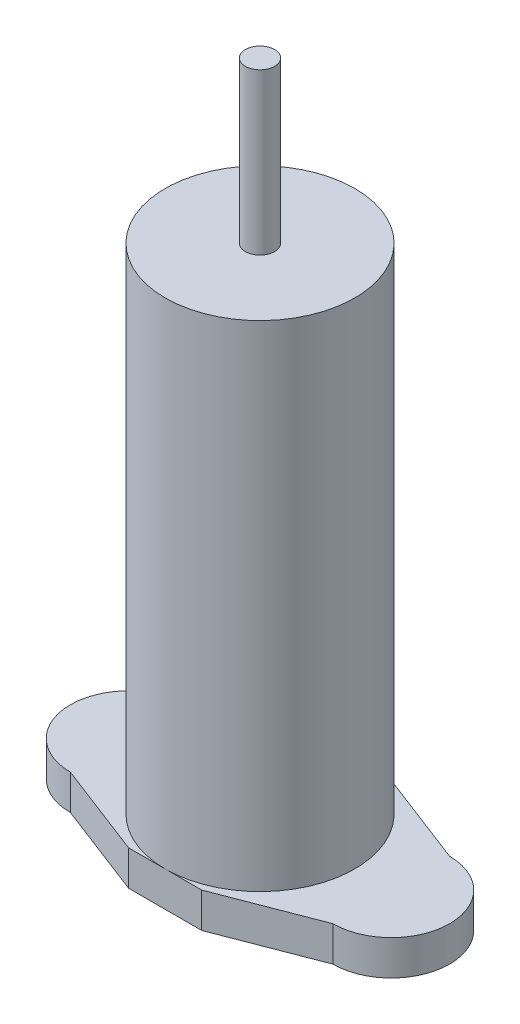
ISO-10303-21;
HEADER;
FILE_DESCRIPTION(('STEP AP214'),'2;1');
FILE_NAME('part.step','',(''),(''),'','','');
FILE_SCHEMA(('AUTOMOTIVE_DESIGN { 1 0 10303 214 1 1 1 1 }'));
ENDSEC;
DATA;
#1=APPLICATION_CONTEXT('core data for automotive mechanical design processes');
#2=APPLICATION_PROTOCOL_DEFINITION('international standard','automotive_design',2000,#1);
#3=PRODUCT_CONTEXT('',#1,'mechanical');
#4=PRODUCT('Part','Part','',(#3));
#5=PRODUCT_RELATED_PRODUCT_CATEGORY('part','',(#4));
#6=PRODUCT_DEFINITION_FORMATION('','',#4);
#7=PRODUCT_DEFINITION_CONTEXT('part definition',#1,'design');
#8=PRODUCT_DEFINITION('design','',#6,#7);
#9=PRODUCT_DEFINITION_SHAPE('','',#8);
#10=(LENGTH_UNIT() NAMED_UNIT(*) SI_UNIT(.MILLI.,.METRE.));
#11=(NAMED_UNIT(*) PLANE_ANGLE_UNIT() SI_UNIT($,.RADIAN.));
#12=(NAMED_UNIT(*) SI_UNIT($,.STERADIAN.) SOLID_ANGLE_UNIT());
#13=UNCERTAINTY_MEASURE_WITH_UNIT(LENGTH_MEASURE(1.E-05),#10,'distance_accuracy_value','');
#14=(GEOMETRIC_REPRESENTATION_CONTEXT(3) GLOBAL_UNCERTAINTY_ASSIGNED_CONTEXT((#13)) GLOBAL_UNIT_ASSIGNED_CONTEXT((#10,
#11,#12)) REPRESENTATION_CONTEXT('',''));
#15=CARTESIAN_POINT('',(0.,0.,0.));
#16=DIRECTION('',(0.,0.,1.));
#17=DIRECTION('',(1.,0.,0.));
#18=AXIS2_PLACEMENT_3D('',#15,#16,#17);
#19=CARTESIAN_POINT('',(0.,2.4,0.));
#20=DIRECTION('',(0.,1.,0.));
#21=DIRECTION('',(0.,0.,1.));
#22=AXIS2_PLACEMENT_3D('',#19,#20,#21);
#23=PLANE('',#22);
#24=DIRECTION('',(1.,0.,0.));
#25=VECTOR('',#24,1.);
#26=CARTESIAN_POINT('',(0.,2.4,6.5));
#27=LINE('',#26,#25);
#28=CARTESIAN_POINT('',(-2.50563715295568,2.4,6.5));
#29=VERTEX_POINT('',#28);
#30=CARTESIAN_POINT('',(0.,2.4,6.5));
#31=VERTEX_POINT('',#30);
#32=EDGE_CURVE('E150',#29,#31,#27,.T.);
#33=ORIENTED_EDGE('',*,*,#32,.T.);
#34=CARTESIAN_POINT('',(0.,2.4,0.));
#35=DIRECTION('',(0.,1.,0.));
#36=DIRECTION('',(0.,0.,1.));
#37=AXIS2_PLACEMENT_3D('',#34,#35,#36);
#38=CIRCLE('',#37,6.5);
#39=CARTESIAN_POINT('',(0.,2.4,-6.5));
#40=VERTEX_POINT('',#39);
#41=EDGE_CURVE('E60',#31,#40,#38,.F.);
#42=ORIENTED_EDGE('',*,*,#41,.T.);
#43=DIRECTION('',(1.,0.,0.));
#44=VECTOR('',#43,1.);
#45=CARTESIAN_POINT('',(0.,2.4,-6.5));
#46=LINE('',#45,#44);
#47=CARTESIAN_POINT('',(-2.50563715295568,2.4,-6.5));
#48=VERTEX_POINT('',#47);
#49=EDGE_CURVE('E202',#48,#40,#46,.T.);
#50=ORIENTED_EDGE('',*,*,#49,.F.);
#51=DIRECTION('',(0.933241177571315,0.,-0.359250475970882));
#52=VECTOR('',#51,1.);
#53=CARTESIAN_POINT('',(-2.50261748932023,2.4,-6.50116241720187));
#54=LINE('',#53,#52);
#55=CARTESIAN_POINT('',(-9.,2.4,-4.));
#56=VERTEX_POINT('',#55);
#57=EDGE_CURVE('E134',#56,#48,#54,.T.);
#58=ORIENTED_EDGE('',*,*,#57,.F.);
#59=CARTESIAN_POINT('',(-9.,2.4,0.));
#60=DIRECTION('',(0.,1.,0.));
#61=DIRECTION('',(0.,0.,1.));
#62=AXIS2_PLACEMENT_3D('',#59,#60,#61);
#63=CIRCLE('',#62,4.);
#64=CARTESIAN_POINT('',(-9.,2.4,4.));
#65=VERTEX_POINT('',#64);
#66=EDGE_CURVE('E126',#56,#65,#63,.T.);
#67=ORIENTED_EDGE('',*,*,#66,.T.);
#68=DIRECTION('',(0.933241177571315,0.,0.359250475970882));
#69=VECTOR('',#68,1.);
#70=CARTESIAN_POINT('',(-2.50261748932023,2.4,6.50116241720187));
#71=LINE('',#70,#69);
#72=EDGE_CURVE('E130',#65,#29,#71,.T.);
#73=ORIENTED_EDGE('',*,*,#72,.T.);
#74=EDGE_LOOP('',(#33,#42,#50,#58,#67,#73));
#75=FACE_BOUND('',#74,.T.);
#76=ADVANCED_FACE('F46',(#75),#23,.T.);
#77=CARTESIAN_POINT('',(2.50261748932023,2.4,6.50116241720187));
#78=DIRECTION('',(-0.359250475970882,0.,-0.933241177571315));
#79=DIRECTION('',(-0.933241177571315,0.,0.359250475970882));
#80=AXIS2_PLACEMENT_3D('',#77,#78,#79);
#81=PLANE('',#80);
#82=DIRECTION('',(0.933241177571315,0.,-0.359250475970882));
#83=VECTOR('',#82,1.);
#84=CARTESIAN_POINT('',(2.50261748932023,0.,6.50116241720187));
#85=LINE('',#84,#83);
#86=CARTESIAN_POINT('',(2.50563715295568,0.,6.5));
#87=VERTEX_POINT('',#86);
#88=CARTESIAN_POINT('',(9.,0.,4.));
#89=VERTEX_POINT('',#88);
#90=EDGE_CURVE('E155',#87,#89,#85,.T.);
#91=ORIENTED_EDGE('',*,*,#90,.T.);
#92=DIRECTION('',(0.,-1.,0.));
#93=VECTOR('',#92,1.);
#94=CARTESIAN_POINT('',(9.,2.4,4.));
#95=LINE('',#94,#93);
#96=CARTESIAN_POINT('',(9.,2.4,4.));
#97=VERTEX_POINT('',#96);
#98=EDGE_CURVE('E13',#97,#89,#95,.T.);
#99=ORIENTED_EDGE('',*,*,#98,.F.);
#100=DIRECTION('',(0.933241177571315,0.,-0.359250475970882));
#101=VECTOR('',#100,1.);
#102=CARTESIAN_POINT('',(2.50261748932023,2.4,6.50116241720187));
#103=LINE('',#102,#101);
#104=CARTESIAN_POINT('',(2.50563715295568,2.4,6.5));
#105=VERTEX_POINT('',#104);
#106=EDGE_CURVE('E173',#105,#97,#103,.T.);
#107=ORIENTED_EDGE('',*,*,#106,.F.);
#108=DIRECTION('',(0.,-1.,0.));
#109=VECTOR('',#108,1.);
#110=CARTESIAN_POINT('',(2.50563715295568,2.4,6.5));
#111=LINE('',#110,#109);
#112=EDGE_CURVE('E154',#105,#87,#111,.T.);
#113=ORIENTED_EDGE('',*,*,#112,.T.);
#114=EDGE_LOOP('',(#91,#99,#107,#113));
#115=FACE_BOUND('',#114,.T.);
#116=ADVANCED_FACE('F48',(#115),#81,.F.);
#117=CARTESIAN_POINT('',(9.,2.4,0.));
#118=DIRECTION('',(0.,-1.,0.));
#119=DIRECTION('',(0.,0.,-1.));
#120=AXIS2_PLACEMENT_3D('',#117,#118,#119);
#121=CYLINDRICAL_SURFACE('',#120,4.);
#122=CARTESIAN_POINT('',(9.,0.,0.));
#123=DIRECTION('',(0.,1.,0.));
#124=DIRECTION('',(0.,0.,1.));
#125=AXIS2_PLACEMENT_3D('',#122,#123,#124);
#126=CIRCLE('',#125,4.);
#127=CARTESIAN_POINT('',(9.,0.,-4.));
#128=VERTEX_POINT('',#127);
#129=EDGE_CURVE('E158',#89,#128,#126,.T.);
#130=ORIENTED_EDGE('',*,*,#129,.T.);
#131=DIRECTION('',(0.,-1.,0.));
#132=VECTOR('',#131,1.);
#133=CARTESIAN_POINT('',(9.,2.4,-4.));
#134=LINE('',#133,#132);
#135=CARTESIAN_POINT('',(9.,2.4,-4.));
#136=VERTEX_POINT('',#135);
#137=EDGE_CURVE('E54',#136,#128,#134,.T.);
#138=ORIENTED_EDGE('',*,*,#137,.F.);
#139=CARTESIAN_POINT('',(9.,2.4,0.));
#140=DIRECTION('',(0.,1.,0.));
#141=DIRECTION('',(0.,0.,1.));
#142=AXIS2_PLACEMENT_3D('',#139,#140,#141);
#143=CIRCLE('',#142,4.);
#144=EDGE_CURVE('E110',#97,#136,#143,.T.);
#145=ORIENTED_EDGE('',*,*,#144,.F.);
#146=ORIENTED_EDGE('',*,*,#98,.T.);
#147=EDGE_LOOP('',(#130,#138,#145,#146));
#148=FACE_BOUND('',#147,.T.);
#149=ADVANCED_FACE('F188',(#148),#121,.T.);
#150=CARTESIAN_POINT('',(2.50261748932023,2.4,-6.50116241720187));
#151=DIRECTION('',(0.359250475970882,0.,-0.933241177571315));
#152=DIRECTION('',(-0.933241177571315,0.,-0.359250475970882));
#153=AXIS2_PLACEMENT_3D('',#150,#151,#152);
#154=PLANE('',#153);
#155=DIRECTION('',(0.933241177571315,0.,0.359250475970882));
#156=VECTOR('',#155,1.);
#157=CARTESIAN_POINT('',(2.50261748932023,0.,-6.50116241720187));
#158=LINE('',#157,#156);
#159=CARTESIAN_POINT('',(2.50563715295568,0.,-6.5));
#160=VERTEX_POINT('',#159);
#161=EDGE_CURVE('E161',#160,#128,#158,.T.);
#162=ORIENTED_EDGE('',*,*,#161,.F.);
#163=DIRECTION('',(0.,-1.,0.));
#164=VECTOR('',#163,1.);
#165=CARTESIAN_POINT('',(2.50563715295568,2.4,-6.5));
#166=LINE('',#165,#164);
#167=CARTESIAN_POINT('',(2.50563715295568,2.4,-6.5));
#168=VERTEX_POINT('',#167);
#169=EDGE_CURVE('E179',#168,#160,#166,.T.);
#170=ORIENTED_EDGE('',*,*,#169,.F.);
#171=DIRECTION('',(0.933241177571315,0.,0.359250475970882));
#172=VECTOR('',#171,1.);
#173=CARTESIAN_POINT('',(2.50261748932023,2.4,-6.50116241720187));
#174=LINE('',#173,#172);
#175=EDGE_CURVE('E187',#168,#136,#174,.T.);
#176=ORIENTED_EDGE('',*,*,#175,.T.);
#177=ORIENTED_EDGE('',*,*,#137,.T.);
#178=EDGE_LOOP('',(#162,#170,#176,#177));
#179=FACE_BOUND('',#178,.T.);
#180=ADVANCED_FACE('F184',(#179),#154,.T.);
#181=CARTESIAN_POINT('',(0.,2.4,-6.5));
#182=DIRECTION('',(0.,0.,-1.));
#183=DIRECTION('',(-1.,0.,0.));
#184=AXIS2_PLACEMENT_3D('',#181,#182,#183);
#185=PLANE('',#184);
#186=ORIENTED_EDGE('',*,*,#49,.T.);
#187=EDGE_CURVE('E199',#40,#168,#46,.T.);
#188=ORIENTED_EDGE('',*,*,#187,.T.);
#189=ORIENTED_EDGE('',*,*,#169,.T.);
#190=DIRECTION('',(1.,0.,0.));
#191=VECTOR('',#190,1.);
#192=CARTESIAN_POINT('',(0.,0.,-6.5));
#193=LINE('',#192,#191);
#194=CARTESIAN_POINT('',(-2.50563715295568,0.,-6.5));
#195=VERTEX_POINT('',#194);
#196=EDGE_CURVE('E164',#195,#160,#193,.T.);
#197=ORIENTED_EDGE('',*,*,#196,.F.);
#198=DIRECTION('',(0.,-1.,0.));
#199=VECTOR('',#198,1.);
#200=CARTESIAN_POINT('',(-2.50563715295568,2.4,-6.5));
#201=LINE('',#200,#199);
#202=EDGE_CURVE('E177',#48,#195,#201,.T.);
#203=ORIENTED_EDGE('',*,*,#202,.F.);
#204=EDGE_LOOP('',(#186,#188,#189,#197,#203));
#205=FACE_BOUND('',#204,.T.);
#206=ADVANCED_FACE('F197',(#205),#185,.T.);
#207=CARTESIAN_POINT('',(-2.50261748932023,2.4,-6.50116241720187));
#208=DIRECTION('',(-0.359250475970882,0.,-0.933241177571315));
#209=DIRECTION('',(-0.933241177571315,0.,0.359250475970882));
#210=AXIS2_PLACEMENT_3D('',#207,#208,#209);
#211=PLANE('',#210);
#212=DIRECTION('',(0.933241177571315,0.,-0.359250475970882));
#213=VECTOR('',#212,1.);
#214=CARTESIAN_POINT('',(-2.50261748932023,0.,-6.50116241720187));
#215=LINE('',#214,#213);
#216=CARTESIAN_POINT('',(-9.,0.,-4.));
#217=VERTEX_POINT('',#216);
#218=EDGE_CURVE('E166',#217,#195,#215,.T.);
#219=ORIENTED_EDGE('',*,*,#218,.F.);
#220=DIRECTION('',(0.,-1.,0.));
#221=VECTOR('',#220,1.);
#222=CARTESIAN_POINT('',(-9.,2.4,-4.));
#223=LINE('',#222,#221);
#224=EDGE_CURVE('E144',#56,#217,#223,.T.);
#225=ORIENTED_EDGE('',*,*,#224,.F.);
#226=ORIENTED_EDGE('',*,*,#57,.T.);
#227=ORIENTED_EDGE('',*,*,#202,.T.);
#228=EDGE_LOOP('',(#219,#225,#226,#227));
#229=FACE_BOUND('',#228,.T.);
#230=ADVANCED_FACE('F207',(#229),#211,.T.);
#231=CARTESIAN_POINT('',(-9.,2.4,0.));
#232=DIRECTION('',(0.,-1.,0.));
#233=DIRECTION('',(0.,0.,-1.));
#234=AXIS2_PLACEMENT_3D('',#231,#232,#233);
#235=CYLINDRICAL_SURFACE('',#234,4.);
#236=CARTESIAN_POINT('',(-9.,0.,0.));
#237=DIRECTION('',(0.,1.,0.));
#238=DIRECTION('',(0.,0.,1.));
#239=AXIS2_PLACEMENT_3D('',#236,#237,#238);
#240=CIRCLE('',#239,4.);
#241=CARTESIAN_POINT('',(-9.,0.,4.));
#242=VERTEX_POINT('',#241);
#243=EDGE_CURVE('E141',#217,#242,#240,.T.);
#244=ORIENTED_EDGE('',*,*,#243,.T.);
#245=DIRECTION('',(0.,-1.,0.));
#246=VECTOR('',#245,1.);
#247=CARTESIAN_POINT('',(-9.,2.4,4.));
#248=LINE('',#247,#246);
#249=EDGE_CURVE('E138',#65,#242,#248,.T.);
#250=ORIENTED_EDGE('',*,*,#249,.F.);
#251=ORIENTED_EDGE('',*,*,#66,.F.);
#252=ORIENTED_EDGE('',*,*,#224,.T.);
#253=EDGE_LOOP('',(#244,#250,#251,#252));
#254=FACE_BOUND('',#253,.T.);
#255=ADVANCED_FACE('F139',(#254),#235,.T.);
#256=CARTESIAN_POINT('',(-2.50261748932023,2.4,6.50116241720187));
#257=DIRECTION('',(0.359250475970882,0.,-0.933241177571315));
#258=DIRECTION('',(-0.933241177571315,0.,-0.359250475970882));
#259=AXIS2_PLACEMENT_3D('',#256,#257,#258);
#260=PLANE('',#259);
#261=DIRECTION('',(0.933241177571315,0.,0.359250475970882));
#262=VECTOR('',#261,1.);
#263=CARTESIAN_POINT('',(-2.50261748932023,0.,6.50116241720187));
#264=LINE('',#263,#262);
#265=CARTESIAN_POINT('',(-2.50563715295568,0.,6.5));
#266=VERTEX_POINT('',#265);
#267=EDGE_CURVE('E170',#242,#266,#264,.T.);
#268=ORIENTED_EDGE('',*,*,#267,.T.);
#269=DIRECTION('',(0.,-1.,0.));
#270=VECTOR('',#269,1.);
#271=CARTESIAN_POINT('',(-2.50563715295568,2.4,6.5));
#272=LINE('',#271,#270);
#273=EDGE_CURVE('E145',#29,#266,#272,.T.);
#274=ORIENTED_EDGE('',*,*,#273,.F.);
#275=ORIENTED_EDGE('',*,*,#72,.F.);
#276=ORIENTED_EDGE('',*,*,#249,.T.);
#277=EDGE_LOOP('',(#268,#274,#275,#276));
#278=FACE_BOUND('',#277,.T.);
#279=ADVANCED_FACE('F147',(#278),#260,.F.);
#280=CARTESIAN_POINT('',(0.,2.4,6.5));
#281=DIRECTION('',(0.,0.,-1.));
#282=DIRECTION('',(-1.,0.,0.));
#283=AXIS2_PLACEMENT_3D('',#280,#281,#282);
#284=PLANE('',#283);
#285=DIRECTION('',(1.,0.,0.));
#286=VECTOR('',#285,1.);
#287=CARTESIAN_POINT('',(0.,0.,6.5));
#288=LINE('',#287,#286);
#289=EDGE_CURVE('E102',#266,#87,#288,.T.);
#290=ORIENTED_EDGE('',*,*,#289,.T.);
#291=ORIENTED_EDGE('',*,*,#112,.F.);
#292=EDGE_CURVE('E68',#31,#105,#27,.T.);
#293=ORIENTED_EDGE('',*,*,#292,.F.);
#294=ORIENTED_EDGE('',*,*,#32,.F.);
#295=ORIENTED_EDGE('',*,*,#273,.T.);
#296=EDGE_LOOP('',(#290,#291,#293,#294,#295));
#297=FACE_BOUND('',#296,.T.);
#298=ADVANCED_FACE('F208',(#297),#284,.F.);
#299=ORIENTED_EDGE('',*,*,#187,.F.);
#300=EDGE_CURVE('E209',#40,#31,#38,.F.);
#301=ORIENTED_EDGE('',*,*,#300,.T.);
#302=ORIENTED_EDGE('',*,*,#292,.T.);
#303=ORIENTED_EDGE('',*,*,#106,.T.);
#304=ORIENTED_EDGE('',*,*,#144,.T.);
#305=ORIENTED_EDGE('',*,*,#175,.F.);
#306=EDGE_LOOP('',(#299,#301,#302,#303,#304,#305));
#307=FACE_BOUND('',#306,.T.);
#308=ADVANCED_FACE('F200',(#307),#23,.T.);
#309=CARTESIAN_POINT('',(0.,0.,0.));
#310=DIRECTION('',(0.,1.,0.));
#311=DIRECTION('',(0.,0.,1.));
#312=AXIS2_PLACEMENT_3D('',#309,#310,#311);
#313=PLANE('',#312);
#314=ORIENTED_EDGE('',*,*,#90,.F.);
#315=ORIENTED_EDGE('',*,*,#289,.F.);
#316=ORIENTED_EDGE('',*,*,#267,.F.);
#317=ORIENTED_EDGE('',*,*,#243,.F.);
#318=ORIENTED_EDGE('',*,*,#218,.T.);
#319=ORIENTED_EDGE('',*,*,#196,.T.);
#320=ORIENTED_EDGE('',*,*,#161,.T.);
#321=ORIENTED_EDGE('',*,*,#129,.F.);
#322=EDGE_LOOP('',(#314,#315,#316,#317,#318,#319,#320,#321));
#323=FACE_BOUND('',#322,.T.);
#324=ADVANCED_FACE('F192',(#323),#313,.F.);
#325=CARTESIAN_POINT('',(0.,36.3,0.));
#326=DIRECTION('',(0.,-1.,0.));
#327=DIRECTION('',(0.,0.,-1.));
#328=AXIS2_PLACEMENT_3D('',#325,#326,#327);
#329=CYLINDRICAL_SURFACE('',#328,6.5);
#330=ORIENTED_EDGE('',*,*,#41,.F.);
#331=ORIENTED_EDGE('',*,*,#300,.F.);
#332=EDGE_LOOP('',(#330,#331));
#333=FACE_BOUND('',#332,.T.);
#334=CARTESIAN_POINT('',(0.,36.3,0.));
#335=DIRECTION('',(0.,1.,0.));
#336=DIRECTION('',(0.,0.,1.));
#337=AXIS2_PLACEMENT_3D('',#334,#335,#336);
#338=CIRCLE('',#337,6.5);
#339=CARTESIAN_POINT('',(0.,36.3,6.5));
#340=VERTEX_POINT('',#339);
#341=EDGE_CURVE('E211',#340,#340,#338,.T.);
#342=ORIENTED_EDGE('',*,*,#341,.F.);
#343=EDGE_LOOP('',(#342));
#344=FACE_BOUND('',#343,.T.);
#345=ADVANCED_FACE('F231',(#333,#344),#329,.T.);
#346=CARTESIAN_POINT('',(0.,36.3,0.));
#347=DIRECTION('',(0.,1.,0.));
#348=DIRECTION('',(0.,0.,1.));
#349=AXIS2_PLACEMENT_3D('',#346,#347,#348);
#350=PLANE('',#349);
#351=CARTESIAN_POINT('',(0.,36.3,0.));
#352=DIRECTION('',(0.,1.,0.));
#353=DIRECTION('',(0.,0.,1.));
#354=AXIS2_PLACEMENT_3D('',#351,#352,#353);
#355=CIRCLE('',#354,1.);
#356=CARTESIAN_POINT('',(0.,36.3,1.));
#357=VERTEX_POINT('',#356);
#358=EDGE_CURVE('E378',#357,#357,#355,.T.);
#359=ORIENTED_EDGE('',*,*,#358,.F.);
#360=EDGE_LOOP('',(#359));
#361=FACE_BOUND('',#360,.T.);
#362=ORIENTED_EDGE('',*,*,#341,.T.);
#363=EDGE_LOOP('',(#362));
#364=FACE_BOUND('',#363,.T.);
#365=ADVANCED_FACE('F284',(#361,#364),#350,.T.);
#366=CARTESIAN_POINT('',(0.,47.3,0.));
#367=DIRECTION('',(0.,-1.,0.));
#368=DIRECTION('',(0.,0.,-1.));
#369=AXIS2_PLACEMENT_3D('',#366,#367,#368);
#370=CYLINDRICAL_SURFACE('',#369,1.);
#371=CARTESIAN_POINT('',(0.,47.3,0.));
#372=DIRECTION('',(0.,1.,0.));
#373=DIRECTION('',(0.,0.,1.));
#374=AXIS2_PLACEMENT_3D('',#371,#372,#373);
#375=CIRCLE('',#374,1.);
#376=CARTESIAN_POINT('',(0.,47.3,1.));
#377=VERTEX_POINT('',#376);
#378=EDGE_CURVE('E377',#377,#377,#375,.T.);
#379=ORIENTED_EDGE('',*,*,#378,.F.);
#380=EDGE_LOOP('',(#379));
#381=FACE_BOUND('',#380,.T.);
#382=ORIENTED_EDGE('',*,*,#358,.T.);
#383=EDGE_LOOP('',(#382));
#384=FACE_BOUND('',#383,.T.);
#385=ADVANCED_FACE('F292',(#381,#384),#370,.T.);
#386=CARTESIAN_POINT('',(0.,47.3,0.));
#387=DIRECTION('',(0.,1.,0.));
#388=DIRECTION('',(0.,0.,1.));
#389=AXIS2_PLACEMENT_3D('',#386,#387,#388);
#390=PLANE('',#389);
#391=ORIENTED_EDGE('',*,*,#378,.T.);
#392=EDGE_LOOP('',(#391));
#393=FACE_BOUND('',#392,.T.);
#394=ADVANCED_FACE('F307',(#393),#390,.T.);
#395=CLOSED_SHELL('',(#76,#116,#149,#180,#206,#230,#255,#279,#298,#308,#324,#345,#365,#385,#394));
#396=MANIFOLD_SOLID_BREP('B2',#395);
#397=ADVANCED_BREP_SHAPE_REPRESENTATION('',(#18,#396),#14);
#398=SHAPE_DEFINITION_REPRESENTATION(#9,#397);
ENDSEC;
END-ISO-10303-21;
